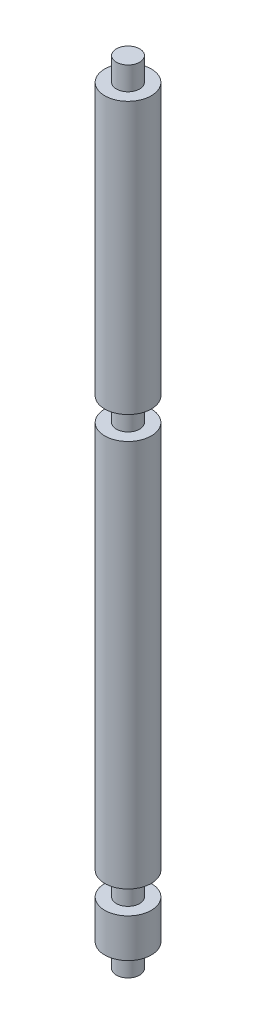
ISO-10303-21;
HEADER;
FILE_DESCRIPTION(('STEP AP214'),'2;1');
FILE_NAME('part.step','',(''),(''),'','','');
FILE_SCHEMA(('AUTOMOTIVE_DESIGN { 1 0 10303 214 1 1 1 1 }'));
ENDSEC;
DATA;
#1=APPLICATION_CONTEXT('core data for automotive mechanical design processes');
#2=APPLICATION_PROTOCOL_DEFINITION('international standard','automotive_design',2000,#1);
#3=PRODUCT_CONTEXT('',#1,'mechanical');
#4=PRODUCT('Part','Part','',(#3));
#5=PRODUCT_RELATED_PRODUCT_CATEGORY('part','',(#4));
#6=PRODUCT_DEFINITION_FORMATION('','',#4);
#7=PRODUCT_DEFINITION_CONTEXT('part definition',#1,'design');
#8=PRODUCT_DEFINITION('design','',#6,#7);
#9=PRODUCT_DEFINITION_SHAPE('','',#8);
#10=(LENGTH_UNIT() NAMED_UNIT(*) SI_UNIT(.MILLI.,.METRE.));
#11=(NAMED_UNIT(*) PLANE_ANGLE_UNIT() SI_UNIT($,.RADIAN.));
#12=(NAMED_UNIT(*) SI_UNIT($,.STERADIAN.) SOLID_ANGLE_UNIT());
#13=UNCERTAINTY_MEASURE_WITH_UNIT(LENGTH_MEASURE(1.E-05),#10,'distance_accuracy_value','');
#14=(GEOMETRIC_REPRESENTATION_CONTEXT(3) GLOBAL_UNCERTAINTY_ASSIGNED_CONTEXT((#13)) GLOBAL_UNIT_ASSIGNED_CONTEXT((#10,
#11,#12)) REPRESENTATION_CONTEXT('',''));
#15=CARTESIAN_POINT('',(0.,0.,0.));
#16=DIRECTION('',(0.,0.,1.));
#17=DIRECTION('',(1.,0.,0.));
#18=AXIS2_PLACEMENT_3D('',#15,#16,#17);
#19=CARTESIAN_POINT('',(0.,102.,0.));
#20=DIRECTION('',(0.,1.,0.));
#21=DIRECTION('',(0.,0.,1.));
#22=AXIS2_PLACEMENT_3D('',#19,#20,#21);
#23=PLANE('',#22);
#24=CARTESIAN_POINT('',(0.,102.,0.));
#25=DIRECTION('',(0.,-1.,0.));
#26=DIRECTION('',(0.,0.,-1.));
#27=AXIS2_PLACEMENT_3D('',#24,#25,#26);
#28=CIRCLE('',#27,1.5);
#29=CARTESIAN_POINT('',(0.,102.,-1.5));
#30=VERTEX_POINT('',#29);
#31=EDGE_CURVE('E10',#30,#30,#28,.T.);
#32=ORIENTED_EDGE('',*,*,#31,.F.);
#33=EDGE_LOOP('',(#32));
#34=FACE_BOUND('',#33,.T.);
#35=ADVANCED_FACE('F34',(#34),#23,.T.);
#36=CARTESIAN_POINT('',(0.,0.,0.));
#37=DIRECTION('',(0.,-1.,0.));
#38=DIRECTION('',(0.,0.,-1.));
#39=AXIS2_PLACEMENT_3D('',#36,#37,#38);
#40=CYLINDRICAL_SURFACE('',#39,1.5);
#41=ORIENTED_EDGE('',*,*,#31,.T.);
#42=EDGE_LOOP('',(#41));
#43=FACE_BOUND('',#42,.T.);
#44=CARTESIAN_POINT('',(0.,99.,0.));
#45=DIRECTION('',(0.,-1.,0.));
#46=DIRECTION('',(0.,0.,-1.));
#47=AXIS2_PLACEMENT_3D('',#44,#45,#46);
#48=CIRCLE('',#47,1.5);
#49=CARTESIAN_POINT('',(0.,99.,-1.5));
#50=VERTEX_POINT('',#49);
#51=EDGE_CURVE('E40',#50,#50,#48,.T.);
#52=ORIENTED_EDGE('',*,*,#51,.F.);
#53=EDGE_LOOP('',(#52));
#54=FACE_BOUND('',#53,.T.);
#55=ADVANCED_FACE('F100',(#43,#54),#40,.T.);
#56=CARTESIAN_POINT('',(0.,99.,-1.5));
#57=DIRECTION('',(0.,1.,0.));
#58=DIRECTION('',(0.,0.,1.));
#59=AXIS2_PLACEMENT_3D('',#56,#57,#58);
#60=PLANE('',#59);
#61=ORIENTED_EDGE('',*,*,#51,.T.);
#62=EDGE_LOOP('',(#61));
#63=FACE_BOUND('',#62,.T.);
#64=CARTESIAN_POINT('',(0.,99.,0.));
#65=DIRECTION('',(0.,-1.,0.));
#66=DIRECTION('',(0.,0.,-1.));
#67=AXIS2_PLACEMENT_3D('',#64,#65,#66);
#68=CIRCLE('',#67,3.);
#69=CARTESIAN_POINT('',(0.,99.,-3.));
#70=VERTEX_POINT('',#69);
#71=EDGE_CURVE('E44',#70,#70,#68,.T.);
#72=ORIENTED_EDGE('',*,*,#71,.F.);
#73=EDGE_LOOP('',(#72));
#74=FACE_BOUND('',#73,.T.);
#75=ADVANCED_FACE('F105',(#63,#74),#60,.T.);
#76=CARTESIAN_POINT('',(0.,0.,0.));
#77=DIRECTION('',(0.,-1.,0.));
#78=DIRECTION('',(0.,0.,-1.));
#79=AXIS2_PLACEMENT_3D('',#76,#77,#78);
#80=CYLINDRICAL_SURFACE('',#79,3.);
#81=ORIENTED_EDGE('',*,*,#71,.T.);
#82=EDGE_LOOP('',(#81));
#83=FACE_BOUND('',#82,.T.);
#84=CARTESIAN_POINT('',(0.,64.,0.));
#85=DIRECTION('',(0.,-1.,0.));
#86=DIRECTION('',(0.,0.,-1.));
#87=AXIS2_PLACEMENT_3D('',#84,#85,#86);
#88=CIRCLE('',#87,3.00000000000001);
#89=CARTESIAN_POINT('',(0.,64.,-3.00000000000001));
#90=VERTEX_POINT('',#89);
#91=EDGE_CURVE('E48',#90,#90,#88,.T.);
#92=ORIENTED_EDGE('',*,*,#91,.F.);
#93=EDGE_LOOP('',(#92));
#94=FACE_BOUND('',#93,.T.);
#95=ADVANCED_FACE('F109',(#83,#94),#80,.T.);
#96=CARTESIAN_POINT('',(0.,64.,-3.00000000000001));
#97=DIRECTION('',(0.,-1.,0.));
#98=DIRECTION('',(0.,0.,-1.));
#99=AXIS2_PLACEMENT_3D('',#96,#97,#98);
#100=PLANE('',#99);
#101=ORIENTED_EDGE('',*,*,#91,.T.);
#102=EDGE_LOOP('',(#101));
#103=FACE_BOUND('',#102,.T.);
#104=CARTESIAN_POINT('',(0.,64.,0.));
#105=DIRECTION('',(0.,-1.,0.));
#106=DIRECTION('',(0.,0.,-1.));
#107=AXIS2_PLACEMENT_3D('',#104,#105,#106);
#108=CIRCLE('',#107,1.5);
#109=CARTESIAN_POINT('',(0.,64.,-1.5));
#110=VERTEX_POINT('',#109);
#111=EDGE_CURVE('E53',#110,#110,#108,.T.);
#112=ORIENTED_EDGE('',*,*,#111,.F.);
#113=EDGE_LOOP('',(#112));
#114=FACE_BOUND('',#113,.T.);
#115=ADVANCED_FACE('F115',(#103,#114),#100,.T.);
#116=CARTESIAN_POINT('',(0.,0.,0.));
#117=DIRECTION('',(0.,-1.,0.));
#118=DIRECTION('',(0.,0.,-1.));
#119=AXIS2_PLACEMENT_3D('',#116,#117,#118);
#120=CYLINDRICAL_SURFACE('',#119,1.5);
#121=ORIENTED_EDGE('',*,*,#111,.T.);
#122=EDGE_LOOP('',(#121));
#123=FACE_BOUND('',#122,.T.);
#124=CARTESIAN_POINT('',(0.,61.,0.));
#125=DIRECTION('',(0.,-1.,0.));
#126=DIRECTION('',(0.,0.,-1.));
#127=AXIS2_PLACEMENT_3D('',#124,#125,#126);
#128=CIRCLE('',#127,1.50000000000001);
#129=CARTESIAN_POINT('',(0.,61.,-1.50000000000001));
#130=VERTEX_POINT('',#129);
#131=EDGE_CURVE('E56',#130,#130,#128,.T.);
#132=ORIENTED_EDGE('',*,*,#131,.F.);
#133=EDGE_LOOP('',(#132));
#134=FACE_BOUND('',#133,.T.);
#135=ADVANCED_FACE('F119',(#123,#134),#120,.T.);
#136=CARTESIAN_POINT('',(0.,61.,-1.50000000000001));
#137=DIRECTION('',(0.,1.,0.));
#138=DIRECTION('',(0.,0.,1.));
#139=AXIS2_PLACEMENT_3D('',#136,#137,#138);
#140=PLANE('',#139);
#141=ORIENTED_EDGE('',*,*,#131,.T.);
#142=EDGE_LOOP('',(#141));
#143=FACE_BOUND('',#142,.T.);
#144=CARTESIAN_POINT('',(0.,61.,0.));
#145=DIRECTION('',(0.,-1.,0.));
#146=DIRECTION('',(0.,0.,-1.));
#147=AXIS2_PLACEMENT_3D('',#144,#145,#146);
#148=CIRCLE('',#147,3.00000000000001);
#149=CARTESIAN_POINT('',(0.,61.,-3.00000000000001));
#150=VERTEX_POINT('',#149);
#151=EDGE_CURVE('E59',#150,#150,#148,.T.);
#152=ORIENTED_EDGE('',*,*,#151,.F.);
#153=EDGE_LOOP('',(#152));
#154=FACE_BOUND('',#153,.T.);
#155=ADVANCED_FACE('F123',(#143,#154),#140,.T.);
#156=CARTESIAN_POINT('',(0.,0.,0.));
#157=DIRECTION('',(0.,-1.,0.));
#158=DIRECTION('',(0.,0.,-1.));
#159=AXIS2_PLACEMENT_3D('',#156,#157,#158);
#160=CYLINDRICAL_SURFACE('',#159,3.00000000000001);
#161=ORIENTED_EDGE('',*,*,#151,.T.);
#162=EDGE_LOOP('',(#161));
#163=FACE_BOUND('',#162,.T.);
#164=CARTESIAN_POINT('',(0.,11.,0.));
#165=DIRECTION('',(0.,-1.,0.));
#166=DIRECTION('',(0.,0.,-1.));
#167=AXIS2_PLACEMENT_3D('',#164,#165,#166);
#168=CIRCLE('',#167,3.00000000000001);
#169=CARTESIAN_POINT('',(0.,11.,-3.00000000000001));
#170=VERTEX_POINT('',#169);
#171=EDGE_CURVE('E62',#170,#170,#168,.T.);
#172=ORIENTED_EDGE('',*,*,#171,.F.);
#173=EDGE_LOOP('',(#172));
#174=FACE_BOUND('',#173,.T.);
#175=ADVANCED_FACE('F127',(#163,#174),#160,.T.);
#176=CARTESIAN_POINT('',(0.,11.,-3.00000000000001));
#177=DIRECTION('',(0.,-1.,0.));
#178=DIRECTION('',(0.,0.,-1.));
#179=AXIS2_PLACEMENT_3D('',#176,#177,#178);
#180=PLANE('',#179);
#181=ORIENTED_EDGE('',*,*,#171,.T.);
#182=EDGE_LOOP('',(#181));
#183=FACE_BOUND('',#182,.T.);
#184=CARTESIAN_POINT('',(0.,11.,0.));
#185=DIRECTION('',(0.,-1.,0.));
#186=DIRECTION('',(0.,0.,-1.));
#187=AXIS2_PLACEMENT_3D('',#184,#185,#186);
#188=CIRCLE('',#187,1.50000000000001);
#189=CARTESIAN_POINT('',(0.,11.,-1.50000000000001));
#190=VERTEX_POINT('',#189);
#191=EDGE_CURVE('E65',#190,#190,#188,.T.);
#192=ORIENTED_EDGE('',*,*,#191,.F.);
#193=EDGE_LOOP('',(#192));
#194=FACE_BOUND('',#193,.T.);
#195=ADVANCED_FACE('F131',(#183,#194),#180,.T.);
#196=CARTESIAN_POINT('',(0.,0.,0.));
#197=DIRECTION('',(0.,-1.,0.));
#198=DIRECTION('',(0.,0.,-1.));
#199=AXIS2_PLACEMENT_3D('',#196,#197,#198);
#200=CYLINDRICAL_SURFACE('',#199,1.50000000000001);
#201=ORIENTED_EDGE('',*,*,#191,.T.);
#202=EDGE_LOOP('',(#201));
#203=FACE_BOUND('',#202,.T.);
#204=CARTESIAN_POINT('',(0.,8.,0.));
#205=DIRECTION('',(0.,-1.,0.));
#206=DIRECTION('',(0.,0.,-1.));
#207=AXIS2_PLACEMENT_3D('',#204,#205,#206);
#208=CIRCLE('',#207,1.50000000000001);
#209=CARTESIAN_POINT('',(0.,8.,-1.50000000000001));
#210=VERTEX_POINT('',#209);
#211=EDGE_CURVE('E68',#210,#210,#208,.T.);
#212=ORIENTED_EDGE('',*,*,#211,.F.);
#213=EDGE_LOOP('',(#212));
#214=FACE_BOUND('',#213,.T.);
#215=ADVANCED_FACE('F135',(#203,#214),#200,.T.);
#216=CARTESIAN_POINT('',(0.,8.,-1.50000000000001));
#217=DIRECTION('',(0.,1.,0.));
#218=DIRECTION('',(0.,0.,1.));
#219=AXIS2_PLACEMENT_3D('',#216,#217,#218);
#220=PLANE('',#219);
#221=ORIENTED_EDGE('',*,*,#211,.T.);
#222=EDGE_LOOP('',(#221));
#223=FACE_BOUND('',#222,.T.);
#224=CARTESIAN_POINT('',(0.,8.,0.));
#225=DIRECTION('',(0.,-1.,0.));
#226=DIRECTION('',(0.,0.,-1.));
#227=AXIS2_PLACEMENT_3D('',#224,#225,#226);
#228=CIRCLE('',#227,3.00000000000001);
#229=CARTESIAN_POINT('',(0.,8.,-3.00000000000001));
#230=VERTEX_POINT('',#229);
#231=EDGE_CURVE('E71',#230,#230,#228,.T.);
#232=ORIENTED_EDGE('',*,*,#231,.F.);
#233=EDGE_LOOP('',(#232));
#234=FACE_BOUND('',#233,.T.);
#235=ADVANCED_FACE('F139',(#223,#234),#220,.T.);
#236=CARTESIAN_POINT('',(0.,0.,0.));
#237=DIRECTION('',(0.,-1.,0.));
#238=DIRECTION('',(0.,0.,-1.));
#239=AXIS2_PLACEMENT_3D('',#236,#237,#238);
#240=CYLINDRICAL_SURFACE('',#239,3.00000000000001);
#241=ORIENTED_EDGE('',*,*,#231,.T.);
#242=EDGE_LOOP('',(#241));
#243=FACE_BOUND('',#242,.T.);
#244=CARTESIAN_POINT('',(0.,3.,0.));
#245=DIRECTION('',(0.,-1.,0.));
#246=DIRECTION('',(0.,0.,-1.));
#247=AXIS2_PLACEMENT_3D('',#244,#245,#246);
#248=CIRCLE('',#247,3.00000000000001);
#249=CARTESIAN_POINT('',(0.,3.,-3.00000000000001));
#250=VERTEX_POINT('',#249);
#251=EDGE_CURVE('E74',#250,#250,#248,.T.);
#252=ORIENTED_EDGE('',*,*,#251,.F.);
#253=EDGE_LOOP('',(#252));
#254=FACE_BOUND('',#253,.T.);
#255=ADVANCED_FACE('F96',(#243,#254),#240,.T.);
#256=CARTESIAN_POINT('',(0.,3.,-3.00000000000001));
#257=DIRECTION('',(0.,-1.,0.));
#258=DIRECTION('',(0.,0.,-1.));
#259=AXIS2_PLACEMENT_3D('',#256,#257,#258);
#260=PLANE('',#259);
#261=ORIENTED_EDGE('',*,*,#251,.T.);
#262=EDGE_LOOP('',(#261));
#263=FACE_BOUND('',#262,.T.);
#264=CARTESIAN_POINT('',(0.,3.,0.));
#265=DIRECTION('',(0.,-1.,0.));
#266=DIRECTION('',(0.,0.,-1.));
#267=AXIS2_PLACEMENT_3D('',#264,#265,#266);
#268=CIRCLE('',#267,1.50000000000001);
#269=CARTESIAN_POINT('',(0.,3.,-1.50000000000001));
#270=VERTEX_POINT('',#269);
#271=EDGE_CURVE('E77',#270,#270,#268,.T.);
#272=ORIENTED_EDGE('',*,*,#271,.F.);
#273=EDGE_LOOP('',(#272));
#274=FACE_BOUND('',#273,.T.);
#275=ADVANCED_FACE('F88',(#263,#274),#260,.T.);
#276=CARTESIAN_POINT('',(0.,0.,0.));
#277=DIRECTION('',(0.,-1.,0.));
#278=DIRECTION('',(0.,0.,-1.));
#279=AXIS2_PLACEMENT_3D('',#276,#277,#278);
#280=CYLINDRICAL_SURFACE('',#279,1.50000000000001);
#281=ORIENTED_EDGE('',*,*,#271,.T.);
#282=EDGE_LOOP('',(#281));
#283=FACE_BOUND('',#282,.T.);
#284=CARTESIAN_POINT('',(0.,0.,0.));
#285=DIRECTION('',(0.,-1.,0.));
#286=DIRECTION('',(0.,0.,-1.));
#287=AXIS2_PLACEMENT_3D('',#284,#285,#286);
#288=CIRCLE('',#287,1.50000000000001);
#289=CARTESIAN_POINT('',(0.,0.,-1.50000000000001));
#290=VERTEX_POINT('',#289);
#291=EDGE_CURVE('E80',#290,#290,#288,.T.);
#292=ORIENTED_EDGE('',*,*,#291,.F.);
#293=EDGE_LOOP('',(#292));
#294=FACE_BOUND('',#293,.T.);
#295=ADVANCED_FACE('F86',(#283,#294),#280,.T.);
#296=CARTESIAN_POINT('',(0.,0.,-1.50000000000001));
#297=DIRECTION('',(0.,-1.,0.));
#298=DIRECTION('',(0.,0.,-1.));
#299=AXIS2_PLACEMENT_3D('',#296,#297,#298);
#300=PLANE('',#299);
#301=ORIENTED_EDGE('',*,*,#291,.T.);
#302=EDGE_LOOP('',(#301));
#303=FACE_BOUND('',#302,.T.);
#304=ADVANCED_FACE('F84',(#303),#300,.T.);
#305=CLOSED_SHELL('',(#35,#55,#75,#95,#115,#135,#155,#175,#195,#215,#235,#255,#275,#295,#304));
#306=MANIFOLD_SOLID_BREP('B2',#305);
#307=ADVANCED_BREP_SHAPE_REPRESENTATION('',(#18,#306),#14);
#308=SHAPE_DEFINITION_REPRESENTATION(#9,#307);
ENDSEC;
END-ISO-10303-21;
